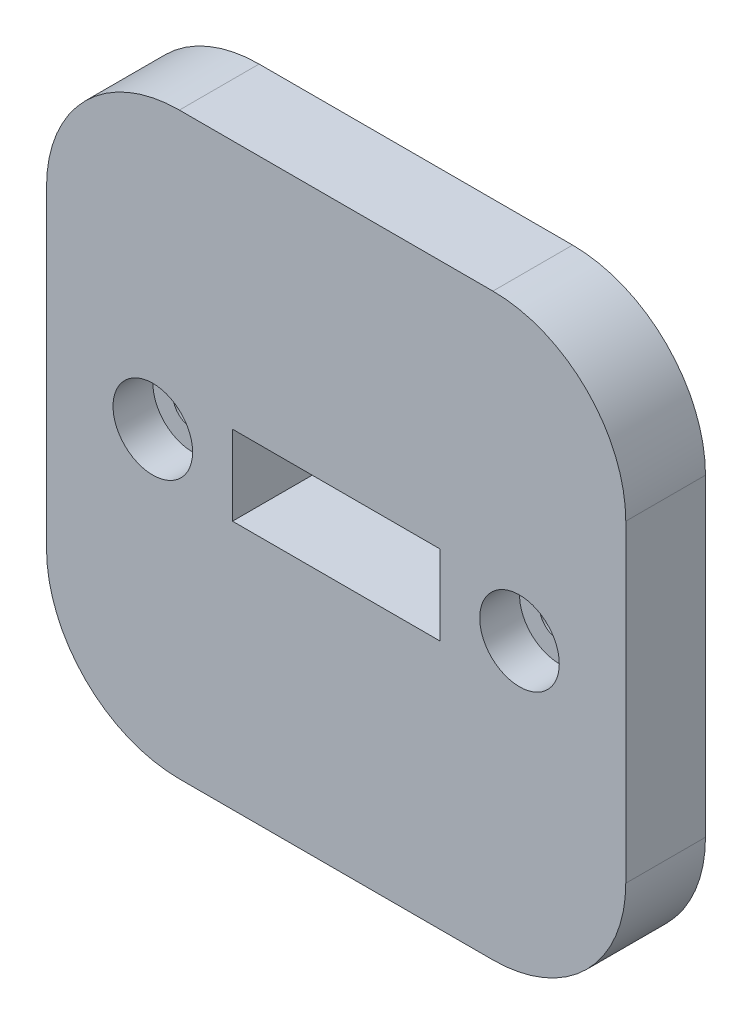
ISO-10303-21;
HEADER;
FILE_DESCRIPTION(('STEP AP214'),'2;1');
FILE_NAME('part.step','',(''),(''),'','','');
FILE_SCHEMA(('AUTOMOTIVE_DESIGN { 1 0 10303 214 1 1 1 1 }'));
ENDSEC;
DATA;
#1=APPLICATION_CONTEXT('core data for automotive mechanical design processes');
#2=APPLICATION_PROTOCOL_DEFINITION('international standard','automotive_design',2000,#1);
#3=PRODUCT_CONTEXT('',#1,'mechanical');
#4=PRODUCT('Part','Part','',(#3));
#5=PRODUCT_RELATED_PRODUCT_CATEGORY('part','',(#4));
#6=PRODUCT_DEFINITION_FORMATION('','',#4);
#7=PRODUCT_DEFINITION_CONTEXT('part definition',#1,'design');
#8=PRODUCT_DEFINITION('design','',#6,#7);
#9=PRODUCT_DEFINITION_SHAPE('','',#8);
#10=(LENGTH_UNIT() NAMED_UNIT(*) SI_UNIT(.MILLI.,.METRE.));
#11=(NAMED_UNIT(*) PLANE_ANGLE_UNIT() SI_UNIT($,.RADIAN.));
#12=(NAMED_UNIT(*) SI_UNIT($,.STERADIAN.) SOLID_ANGLE_UNIT());
#13=UNCERTAINTY_MEASURE_WITH_UNIT(LENGTH_MEASURE(1.E-05),#10,'distance_accuracy_value','');
#14=(GEOMETRIC_REPRESENTATION_CONTEXT(3) GLOBAL_UNCERTAINTY_ASSIGNED_CONTEXT((#13)) GLOBAL_UNIT_ASSIGNED_CONTEXT((#10,
#11,#12)) REPRESENTATION_CONTEXT('',''));
#15=CARTESIAN_POINT('',(0.,0.,0.));
#16=DIRECTION('',(0.,0.,1.));
#17=DIRECTION('',(1.,0.,0.));
#18=AXIS2_PLACEMENT_3D('',#15,#16,#17);
#19=CARTESIAN_POINT('',(35.6,21.8,0.));
#20=DIRECTION('',(0.,0.,1.));
#21=DIRECTION('',(1.,0.,0.));
#22=AXIS2_PLACEMENT_3D('',#19,#20,#21);
#23=CYLINDRICAL_SURFACE('',#22,1.5);
#24=CARTESIAN_POINT('',(35.6,21.8,0.));
#25=DIRECTION('',(0.,0.,1.));
#26=DIRECTION('',(1.,0.,0.));
#27=AXIS2_PLACEMENT_3D('',#24,#25,#26);
#28=CIRCLE('',#27,1.5);
#29=CARTESIAN_POINT('',(37.1,21.8,0.));
#30=VERTEX_POINT('',#29);
#31=EDGE_CURVE('E220',#30,#30,#28,.T.);
#32=ORIENTED_EDGE('',*,*,#31,.F.);
#33=EDGE_LOOP('',(#32));
#34=FACE_BOUND('',#33,.T.);
#35=CARTESIAN_POINT('',(35.6,21.8,3.));
#36=DIRECTION('',(0.,0.,1.));
#37=DIRECTION('',(1.,0.,0.));
#38=AXIS2_PLACEMENT_3D('',#35,#36,#37);
#39=CIRCLE('',#38,1.5);
#40=CARTESIAN_POINT('',(37.1,21.8,3.));
#41=VERTEX_POINT('',#40);
#42=EDGE_CURVE('E37',#41,#41,#39,.F.);
#43=ORIENTED_EDGE('',*,*,#42,.F.);
#44=EDGE_LOOP('',(#43));
#45=FACE_BOUND('',#44,.T.);
#46=ADVANCED_FACE('F33',(#34,#45),#23,.F.);
#47=CARTESIAN_POINT('',(8.00000000000001,21.8,0.));
#48=DIRECTION('',(0.,0.,1.));
#49=DIRECTION('',(1.,0.,0.));
#50=AXIS2_PLACEMENT_3D('',#47,#48,#49);
#51=CYLINDRICAL_SURFACE('',#50,1.5);
#52=CARTESIAN_POINT('',(8.00000000000001,21.8,0.));
#53=DIRECTION('',(0.,0.,1.));
#54=DIRECTION('',(1.,0.,0.));
#55=AXIS2_PLACEMENT_3D('',#52,#53,#54);
#56=CIRCLE('',#55,1.5);
#57=CARTESIAN_POINT('',(9.50000000000001,21.8,0.));
#58=VERTEX_POINT('',#57);
#59=EDGE_CURVE('E148',#58,#58,#56,.T.);
#60=ORIENTED_EDGE('',*,*,#59,.F.);
#61=EDGE_LOOP('',(#60));
#62=FACE_BOUND('',#61,.T.);
#63=CARTESIAN_POINT('',(8.00000000000001,21.8,3.));
#64=DIRECTION('',(0.,0.,1.));
#65=DIRECTION('',(1.,0.,0.));
#66=AXIS2_PLACEMENT_3D('',#63,#64,#65);
#67=CIRCLE('',#66,1.5);
#68=CARTESIAN_POINT('',(9.50000000000001,21.8,3.));
#69=VERTEX_POINT('',#68);
#70=EDGE_CURVE('E218',#69,#69,#67,.F.);
#71=ORIENTED_EDGE('',*,*,#70,.F.);
#72=EDGE_LOOP('',(#71));
#73=FACE_BOUND('',#72,.T.);
#74=ADVANCED_FACE('F246',(#62,#73),#51,.F.);
#75=CARTESIAN_POINT('',(0.,0.,6.));
#76=DIRECTION('',(1.,0.,0.));
#77=DIRECTION('',(0.,1.,0.));
#78=AXIS2_PLACEMENT_3D('',#75,#76,#77);
#79=PLANE('',#78);
#80=DIRECTION('',(0.,-1.,0.));
#81=VECTOR('',#80,1.);
#82=CARTESIAN_POINT('',(0.,0.,0.));
#83=LINE('',#82,#81);
#84=CARTESIAN_POINT('',(0.,33.6,0.));
#85=VERTEX_POINT('',#84);
#86=CARTESIAN_POINT('',(0.,10.,0.));
#87=VERTEX_POINT('',#86);
#88=EDGE_CURVE('E160',#85,#87,#83,.T.);
#89=ORIENTED_EDGE('',*,*,#88,.T.);
#90=DIRECTION('',(0.,0.,-1.));
#91=VECTOR('',#90,1.);
#92=CARTESIAN_POINT('',(0.,10.,6.));
#93=LINE('',#92,#91);
#94=CARTESIAN_POINT('',(0.,10.,6.));
#95=VERTEX_POINT('',#94);
#96=EDGE_CURVE('E216',#87,#95,#93,.F.);
#97=ORIENTED_EDGE('',*,*,#96,.T.);
#98=DIRECTION('',(0.,-1.,0.));
#99=VECTOR('',#98,1.);
#100=CARTESIAN_POINT('',(0.,0.,6.));
#101=LINE('',#100,#99);
#102=CARTESIAN_POINT('',(0.,33.6,6.));
#103=VERTEX_POINT('',#102);
#104=EDGE_CURVE('E164',#103,#95,#101,.T.);
#105=ORIENTED_EDGE('',*,*,#104,.F.);
#106=DIRECTION('',(0.,0.,-1.));
#107=VECTOR('',#106,1.);
#108=CARTESIAN_POINT('',(0.,33.6,6.));
#109=LINE('',#108,#107);
#110=EDGE_CURVE('E213',#103,#85,#109,.T.);
#111=ORIENTED_EDGE('',*,*,#110,.T.);
#112=EDGE_LOOP('',(#89,#97,#105,#111));
#113=FACE_BOUND('',#112,.T.);
#114=ADVANCED_FACE('F252',(#113),#79,.F.);
#115=CARTESIAN_POINT('',(0.,0.,6.));
#116=DIRECTION('',(0.,1.,0.));
#117=DIRECTION('',(0.,0.,1.));
#118=AXIS2_PLACEMENT_3D('',#115,#116,#117);
#119=PLANE('',#118);
#120=DIRECTION('',(1.,0.,0.));
#121=VECTOR('',#120,1.);
#122=CARTESIAN_POINT('',(0.,0.,0.));
#123=LINE('',#122,#121);
#124=CARTESIAN_POINT('',(10.,0.,0.));
#125=VERTEX_POINT('',#124);
#126=CARTESIAN_POINT('',(33.6,0.,0.));
#127=VERTEX_POINT('',#126);
#128=EDGE_CURVE('E180',#125,#127,#123,.T.);
#129=ORIENTED_EDGE('',*,*,#128,.T.);
#130=DIRECTION('',(0.,0.,-1.));
#131=VECTOR('',#130,1.);
#132=CARTESIAN_POINT('',(33.6,0.,6.));
#133=LINE('',#132,#131);
#134=CARTESIAN_POINT('',(33.6,0.,6.));
#135=VERTEX_POINT('',#134);
#136=EDGE_CURVE('E203',#127,#135,#133,.F.);
#137=ORIENTED_EDGE('',*,*,#136,.T.);
#138=DIRECTION('',(1.,0.,0.));
#139=VECTOR('',#138,1.);
#140=CARTESIAN_POINT('',(0.,0.,6.));
#141=LINE('',#140,#139);
#142=CARTESIAN_POINT('',(10.,0.,6.));
#143=VERTEX_POINT('',#142);
#144=EDGE_CURVE('E167',#143,#135,#141,.T.);
#145=ORIENTED_EDGE('',*,*,#144,.F.);
#146=DIRECTION('',(0.,0.,-1.));
#147=VECTOR('',#146,1.);
#148=CARTESIAN_POINT('',(10.,0.,6.));
#149=LINE('',#148,#147);
#150=EDGE_CURVE('E200',#143,#125,#149,.T.);
#151=ORIENTED_EDGE('',*,*,#150,.T.);
#152=EDGE_LOOP('',(#129,#137,#145,#151));
#153=FACE_BOUND('',#152,.T.);
#154=ADVANCED_FACE('F287',(#153),#119,.F.);
#155=CARTESIAN_POINT('',(43.6,0.,6.));
#156=DIRECTION('',(-1.,0.,0.));
#157=DIRECTION('',(0.,0.,1.));
#158=AXIS2_PLACEMENT_3D('',#155,#156,#157);
#159=PLANE('',#158);
#160=DIRECTION('',(0.,1.,0.));
#161=VECTOR('',#160,1.);
#162=CARTESIAN_POINT('',(43.6,0.,6.));
#163=LINE('',#162,#161);
#164=CARTESIAN_POINT('',(43.6,10.,6.));
#165=VERTEX_POINT('',#164);
#166=CARTESIAN_POINT('',(43.6,33.6,6.));
#167=VERTEX_POINT('',#166);
#168=EDGE_CURVE('E171',#165,#167,#163,.T.);
#169=ORIENTED_EDGE('',*,*,#168,.F.);
#170=DIRECTION('',(0.,0.,-1.));
#171=VECTOR('',#170,1.);
#172=CARTESIAN_POINT('',(43.6,10.,6.));
#173=LINE('',#172,#171);
#174=CARTESIAN_POINT('',(43.6,10.,0.));
#175=VERTEX_POINT('',#174);
#176=EDGE_CURVE('E189',#165,#175,#173,.T.);
#177=ORIENTED_EDGE('',*,*,#176,.T.);
#178=DIRECTION('',(0.,1.,0.));
#179=VECTOR('',#178,1.);
#180=CARTESIAN_POINT('',(43.6,0.,0.));
#181=LINE('',#180,#179);
#182=CARTESIAN_POINT('',(43.6,33.6,0.));
#183=VERTEX_POINT('',#182);
#184=EDGE_CURVE('E183',#175,#183,#181,.T.);
#185=ORIENTED_EDGE('',*,*,#184,.T.);
#186=DIRECTION('',(0.,0.,-1.));
#187=VECTOR('',#186,1.);
#188=CARTESIAN_POINT('',(43.6,33.6,6.));
#189=LINE('',#188,#187);
#190=EDGE_CURVE('E177',#183,#167,#189,.F.);
#191=ORIENTED_EDGE('',*,*,#190,.T.);
#192=EDGE_LOOP('',(#169,#177,#185,#191));
#193=FACE_BOUND('',#192,.T.);
#194=ADVANCED_FACE('F283',(#193),#159,.F.);
#195=CARTESIAN_POINT('',(0.,43.6,6.));
#196=DIRECTION('',(0.,-1.,0.));
#197=DIRECTION('',(0.,0.,-1.));
#198=AXIS2_PLACEMENT_3D('',#195,#196,#197);
#199=PLANE('',#198);
#200=DIRECTION('',(-1.,0.,0.));
#201=VECTOR('',#200,1.);
#202=CARTESIAN_POINT('',(0.,43.6,6.));
#203=LINE('',#202,#201);
#204=CARTESIAN_POINT('',(33.6,43.6,6.));
#205=VERTEX_POINT('',#204);
#206=CARTESIAN_POINT('',(10.,43.6,6.));
#207=VERTEX_POINT('',#206);
#208=EDGE_CURVE('E174',#205,#207,#203,.T.);
#209=ORIENTED_EDGE('',*,*,#208,.F.);
#210=DIRECTION('',(0.,0.,-1.));
#211=VECTOR('',#210,1.);
#212=CARTESIAN_POINT('',(33.6,43.6,6.));
#213=LINE('',#212,#211);
#214=CARTESIAN_POINT('',(33.6,43.6,0.));
#215=VERTEX_POINT('',#214);
#216=EDGE_CURVE('E11',#205,#215,#213,.T.);
#217=ORIENTED_EDGE('',*,*,#216,.T.);
#218=DIRECTION('',(-1.,0.,0.));
#219=VECTOR('',#218,1.);
#220=CARTESIAN_POINT('',(0.,43.6,0.));
#221=LINE('',#220,#219);
#222=CARTESIAN_POINT('',(10.,43.6,0.));
#223=VERTEX_POINT('',#222);
#224=EDGE_CURVE('E168',#215,#223,#221,.T.);
#225=ORIENTED_EDGE('',*,*,#224,.T.);
#226=DIRECTION('',(0.,0.,-1.));
#227=VECTOR('',#226,1.);
#228=CARTESIAN_POINT('',(10.,43.6,6.));
#229=LINE('',#228,#227);
#230=EDGE_CURVE('E42',#223,#207,#229,.F.);
#231=ORIENTED_EDGE('',*,*,#230,.T.);
#232=EDGE_LOOP('',(#209,#217,#225,#231));
#233=FACE_BOUND('',#232,.T.);
#234=ADVANCED_FACE('F275',(#233),#199,.F.);
#235=CARTESIAN_POINT('',(0.,0.,6.));
#236=DIRECTION('',(0.,0.,-1.));
#237=DIRECTION('',(-1.,0.,0.));
#238=AXIS2_PLACEMENT_3D('',#235,#236,#237);
#239=PLANE('',#238);
#240=CARTESIAN_POINT('',(35.6,21.8,6.));
#241=DIRECTION('',(0.,0.,1.));
#242=DIRECTION('',(1.,0.,0.));
#243=AXIS2_PLACEMENT_3D('',#240,#241,#242);
#244=CIRCLE('',#243,2.995);
#245=CARTESIAN_POINT('',(38.595,21.8,6.));
#246=VERTEX_POINT('',#245);
#247=EDGE_CURVE('E233',#246,#246,#244,.T.);
#248=ORIENTED_EDGE('',*,*,#247,.F.);
#249=EDGE_LOOP('',(#248));
#250=FACE_BOUND('',#249,.T.);
#251=CARTESIAN_POINT('',(8.00000000000001,21.8,6.));
#252=DIRECTION('',(0.,0.,1.));
#253=DIRECTION('',(1.,0.,0.));
#254=AXIS2_PLACEMENT_3D('',#251,#252,#253);
#255=CIRCLE('',#254,2.995);
#256=CARTESIAN_POINT('',(10.995,21.8,6.));
#257=VERTEX_POINT('',#256);
#258=EDGE_CURVE('E226',#257,#257,#255,.T.);
#259=ORIENTED_EDGE('',*,*,#258,.F.);
#260=EDGE_LOOP('',(#259));
#261=FACE_BOUND('',#260,.T.);
#262=DIRECTION('',(1.,0.,0.));
#263=VECTOR('',#262,1.);
#264=CARTESIAN_POINT('',(14.,18.8,6.));
#265=LINE('',#264,#263);
#266=CARTESIAN_POINT('',(14.,18.8,6.));
#267=VERTEX_POINT('',#266);
#268=CARTESIAN_POINT('',(29.6,18.8,6.));
#269=VERTEX_POINT('',#268);
#270=EDGE_CURVE('E154',#267,#269,#265,.T.);
#271=ORIENTED_EDGE('',*,*,#270,.F.);
#272=DIRECTION('',(0.,-1.,0.));
#273=VECTOR('',#272,1.);
#274=CARTESIAN_POINT('',(14.,18.8,6.));
#275=LINE('',#274,#273);
#276=CARTESIAN_POINT('',(14.,24.8,6.));
#277=VERTEX_POINT('',#276);
#278=EDGE_CURVE('E50',#277,#267,#275,.T.);
#279=ORIENTED_EDGE('',*,*,#278,.F.);
#280=DIRECTION('',(-1.,0.,0.));
#281=VECTOR('',#280,1.);
#282=CARTESIAN_POINT('',(14.,24.8,6.));
#283=LINE('',#282,#281);
#284=CARTESIAN_POINT('',(29.6,24.8,6.));
#285=VERTEX_POINT('',#284);
#286=EDGE_CURVE('E142',#285,#277,#283,.T.);
#287=ORIENTED_EDGE('',*,*,#286,.F.);
#288=DIRECTION('',(0.,1.,0.));
#289=VECTOR('',#288,1.);
#290=CARTESIAN_POINT('',(29.6,18.8,6.));
#291=LINE('',#290,#289);
#292=EDGE_CURVE('E145',#269,#285,#291,.T.);
#293=ORIENTED_EDGE('',*,*,#292,.F.);
#294=EDGE_LOOP('',(#271,#279,#287,#293));
#295=FACE_BOUND('',#294,.T.);
#296=ORIENTED_EDGE('',*,*,#144,.T.);
#297=CARTESIAN_POINT('',(33.6,10.,6.));
#298=DIRECTION('',(0.,0.,-1.));
#299=DIRECTION('',(-1.,0.,0.));
#300=AXIS2_PLACEMENT_3D('',#297,#298,#299);
#301=CIRCLE('',#300,10.);
#302=EDGE_CURVE('E211',#135,#165,#301,.F.);
#303=ORIENTED_EDGE('',*,*,#302,.T.);
#304=ORIENTED_EDGE('',*,*,#168,.T.);
#305=CARTESIAN_POINT('',(33.6,33.6,6.));
#306=DIRECTION('',(0.,0.,-1.));
#307=DIRECTION('',(-1.,0.,0.));
#308=AXIS2_PLACEMENT_3D('',#305,#306,#307);
#309=CIRCLE('',#308,10.);
#310=EDGE_CURVE('E207',#167,#205,#309,.F.);
#311=ORIENTED_EDGE('',*,*,#310,.T.);
#312=ORIENTED_EDGE('',*,*,#208,.T.);
#313=CARTESIAN_POINT('',(10.,33.6,6.));
#314=DIRECTION('',(0.,0.,-1.));
#315=DIRECTION('',(-1.,0.,0.));
#316=AXIS2_PLACEMENT_3D('',#313,#314,#315);
#317=CIRCLE('',#316,10.);
#318=EDGE_CURVE('E205',#207,#103,#317,.F.);
#319=ORIENTED_EDGE('',*,*,#318,.T.);
#320=ORIENTED_EDGE('',*,*,#104,.T.);
#321=CARTESIAN_POINT('',(10.,10.,6.));
#322=DIRECTION('',(0.,0.,-1.));
#323=DIRECTION('',(-1.,0.,0.));
#324=AXIS2_PLACEMENT_3D('',#321,#322,#323);
#325=CIRCLE('',#324,10.);
#326=EDGE_CURVE('E209',#95,#143,#325,.F.);
#327=ORIENTED_EDGE('',*,*,#326,.T.);
#328=EDGE_LOOP('',(#296,#303,#304,#311,#312,#319,#320,#327));
#329=FACE_BOUND('',#328,.T.);
#330=ADVANCED_FACE('F272',(#250,#261,#295,#329),#239,.F.);
#331=CARTESIAN_POINT('',(0.,0.,0.));
#332=DIRECTION('',(0.,0.,-1.));
#333=DIRECTION('',(-1.,0.,0.));
#334=AXIS2_PLACEMENT_3D('',#331,#332,#333);
#335=PLANE('',#334);
#336=ORIENTED_EDGE('',*,*,#31,.T.);
#337=EDGE_LOOP('',(#336));
#338=FACE_BOUND('',#337,.T.);
#339=ORIENTED_EDGE('',*,*,#59,.T.);
#340=EDGE_LOOP('',(#339));
#341=FACE_BOUND('',#340,.T.);
#342=DIRECTION('',(0.,-1.,0.));
#343=VECTOR('',#342,1.);
#344=CARTESIAN_POINT('',(14.,18.8,0.));
#345=LINE('',#344,#343);
#346=CARTESIAN_POINT('',(14.,24.8,0.));
#347=VERTEX_POINT('',#346);
#348=CARTESIAN_POINT('',(14.,18.8,0.));
#349=VERTEX_POINT('',#348);
#350=EDGE_CURVE('E126',#347,#349,#345,.T.);
#351=ORIENTED_EDGE('',*,*,#350,.T.);
#352=DIRECTION('',(1.,0.,0.));
#353=VECTOR('',#352,1.);
#354=CARTESIAN_POINT('',(14.,18.8,0.));
#355=LINE('',#354,#353);
#356=CARTESIAN_POINT('',(29.6,18.8,0.));
#357=VERTEX_POINT('',#356);
#358=EDGE_CURVE('E135',#349,#357,#355,.T.);
#359=ORIENTED_EDGE('',*,*,#358,.T.);
#360=DIRECTION('',(0.,1.,0.));
#361=VECTOR('',#360,1.);
#362=CARTESIAN_POINT('',(29.6,18.8,0.));
#363=LINE('',#362,#361);
#364=CARTESIAN_POINT('',(29.6,24.8,0.));
#365=VERTEX_POINT('',#364);
#366=EDGE_CURVE('E58',#357,#365,#363,.T.);
#367=ORIENTED_EDGE('',*,*,#366,.T.);
#368=DIRECTION('',(-1.,0.,0.));
#369=VECTOR('',#368,1.);
#370=CARTESIAN_POINT('',(14.,24.8,0.));
#371=LINE('',#370,#369);
#372=EDGE_CURVE('E132',#365,#347,#371,.T.);
#373=ORIENTED_EDGE('',*,*,#372,.T.);
#374=EDGE_LOOP('',(#351,#359,#367,#373));
#375=FACE_BOUND('',#374,.T.);
#376=ORIENTED_EDGE('',*,*,#184,.F.);
#377=CARTESIAN_POINT('',(33.6,10.,0.));
#378=DIRECTION('',(0.,0.,-1.));
#379=DIRECTION('',(-1.,0.,0.));
#380=AXIS2_PLACEMENT_3D('',#377,#378,#379);
#381=CIRCLE('',#380,10.);
#382=EDGE_CURVE('E198',#175,#127,#381,.T.);
#383=ORIENTED_EDGE('',*,*,#382,.T.);
#384=ORIENTED_EDGE('',*,*,#128,.F.);
#385=CARTESIAN_POINT('',(10.,10.,0.));
#386=DIRECTION('',(0.,0.,-1.));
#387=DIRECTION('',(-1.,0.,0.));
#388=AXIS2_PLACEMENT_3D('',#385,#386,#387);
#389=CIRCLE('',#388,10.);
#390=EDGE_CURVE('E196',#125,#87,#389,.T.);
#391=ORIENTED_EDGE('',*,*,#390,.T.);
#392=ORIENTED_EDGE('',*,*,#88,.F.);
#393=CARTESIAN_POINT('',(10.,33.6,0.));
#394=DIRECTION('',(0.,0.,-1.));
#395=DIRECTION('',(-1.,0.,0.));
#396=AXIS2_PLACEMENT_3D('',#393,#394,#395);
#397=CIRCLE('',#396,10.);
#398=EDGE_CURVE('E192',#85,#223,#397,.T.);
#399=ORIENTED_EDGE('',*,*,#398,.T.);
#400=ORIENTED_EDGE('',*,*,#224,.F.);
#401=CARTESIAN_POINT('',(33.6,33.6,0.));
#402=DIRECTION('',(0.,0.,-1.));
#403=DIRECTION('',(-1.,0.,0.));
#404=AXIS2_PLACEMENT_3D('',#401,#402,#403);
#405=CIRCLE('',#404,10.);
#406=EDGE_CURVE('E194',#215,#183,#405,.T.);
#407=ORIENTED_EDGE('',*,*,#406,.T.);
#408=EDGE_LOOP('',(#376,#383,#384,#391,#392,#399,#400,#407));
#409=FACE_BOUND('',#408,.T.);
#410=ADVANCED_FACE('F139',(#338,#341,#375,#409),#335,.T.);
#411=CARTESIAN_POINT('',(33.6,10.,6.));
#412=DIRECTION('',(0.,0.,-1.));
#413=DIRECTION('',(-1.,0.,0.));
#414=AXIS2_PLACEMENT_3D('',#411,#412,#413);
#415=CYLINDRICAL_SURFACE('',#414,10.);
#416=ORIENTED_EDGE('',*,*,#302,.F.);
#417=ORIENTED_EDGE('',*,*,#136,.F.);
#418=ORIENTED_EDGE('',*,*,#382,.F.);
#419=ORIENTED_EDGE('',*,*,#176,.F.);
#420=EDGE_LOOP('',(#416,#417,#418,#419));
#421=FACE_BOUND('',#420,.T.);
#422=ADVANCED_FACE('F279',(#421),#415,.T.);
#423=CARTESIAN_POINT('',(10.,10.,6.));
#424=DIRECTION('',(0.,0.,-1.));
#425=DIRECTION('',(-1.,0.,0.));
#426=AXIS2_PLACEMENT_3D('',#423,#424,#425);
#427=CYLINDRICAL_SURFACE('',#426,10.);
#428=ORIENTED_EDGE('',*,*,#326,.F.);
#429=ORIENTED_EDGE('',*,*,#96,.F.);
#430=ORIENTED_EDGE('',*,*,#390,.F.);
#431=ORIENTED_EDGE('',*,*,#150,.F.);
#432=EDGE_LOOP('',(#428,#429,#430,#431));
#433=FACE_BOUND('',#432,.T.);
#434=ADVANCED_FACE('F297',(#433),#427,.T.);
#435=CARTESIAN_POINT('',(33.6,33.6,6.));
#436=DIRECTION('',(0.,0.,-1.));
#437=DIRECTION('',(-1.,0.,0.));
#438=AXIS2_PLACEMENT_3D('',#435,#436,#437);
#439=CYLINDRICAL_SURFACE('',#438,10.);
#440=ORIENTED_EDGE('',*,*,#310,.F.);
#441=ORIENTED_EDGE('',*,*,#190,.F.);
#442=ORIENTED_EDGE('',*,*,#406,.F.);
#443=ORIENTED_EDGE('',*,*,#216,.F.);
#444=EDGE_LOOP('',(#440,#441,#442,#443));
#445=FACE_BOUND('',#444,.T.);
#446=ADVANCED_FACE('F300',(#445),#439,.T.);
#447=CARTESIAN_POINT('',(10.,33.6,6.));
#448=DIRECTION('',(0.,0.,-1.));
#449=DIRECTION('',(-1.,0.,0.));
#450=AXIS2_PLACEMENT_3D('',#447,#448,#449);
#451=CYLINDRICAL_SURFACE('',#450,10.);
#452=ORIENTED_EDGE('',*,*,#318,.F.);
#453=ORIENTED_EDGE('',*,*,#230,.F.);
#454=ORIENTED_EDGE('',*,*,#398,.F.);
#455=ORIENTED_EDGE('',*,*,#110,.F.);
#456=EDGE_LOOP('',(#452,#453,#454,#455));
#457=FACE_BOUND('',#456,.T.);
#458=ADVANCED_FACE('F35',(#457),#451,.T.);
#459=CARTESIAN_POINT('',(14.,18.8,0.));
#460=DIRECTION('',(-1.,0.,0.));
#461=DIRECTION('',(0.,0.,1.));
#462=AXIS2_PLACEMENT_3D('',#459,#460,#461);
#463=PLANE('',#462);
#464=ORIENTED_EDGE('',*,*,#278,.T.);
#465=DIRECTION('',(0.,0.,1.));
#466=VECTOR('',#465,1.);
#467=CARTESIAN_POINT('',(14.,18.8,0.));
#468=LINE('',#467,#466);
#469=EDGE_CURVE('E122',#349,#267,#468,.T.);
#470=ORIENTED_EDGE('',*,*,#469,.F.);
#471=ORIENTED_EDGE('',*,*,#350,.F.);
#472=DIRECTION('',(0.,0.,1.));
#473=VECTOR('',#472,1.);
#474=CARTESIAN_POINT('',(14.,24.8,0.));
#475=LINE('',#474,#473);
#476=EDGE_CURVE('E158',#347,#277,#475,.T.);
#477=ORIENTED_EDGE('',*,*,#476,.T.);
#478=EDGE_LOOP('',(#464,#470,#471,#477));
#479=FACE_BOUND('',#478,.T.);
#480=ADVANCED_FACE('F124',(#479),#463,.F.);
#481=CARTESIAN_POINT('',(14.,24.8,0.));
#482=DIRECTION('',(0.,1.,0.));
#483=DIRECTION('',(0.,0.,1.));
#484=AXIS2_PLACEMENT_3D('',#481,#482,#483);
#485=PLANE('',#484);
#486=ORIENTED_EDGE('',*,*,#286,.T.);
#487=ORIENTED_EDGE('',*,*,#476,.F.);
#488=ORIENTED_EDGE('',*,*,#372,.F.);
#489=DIRECTION('',(0.,0.,1.));
#490=VECTOR('',#489,1.);
#491=CARTESIAN_POINT('',(29.6,24.8,0.));
#492=LINE('',#491,#490);
#493=EDGE_CURVE('E161',#365,#285,#492,.T.);
#494=ORIENTED_EDGE('',*,*,#493,.T.);
#495=EDGE_LOOP('',(#486,#487,#488,#494));
#496=FACE_BOUND('',#495,.T.);
#497=ADVANCED_FACE('F260',(#496),#485,.F.);
#498=CARTESIAN_POINT('',(29.6,18.8,0.));
#499=DIRECTION('',(1.,0.,0.));
#500=DIRECTION('',(0.,0.,-1.));
#501=AXIS2_PLACEMENT_3D('',#498,#499,#500);
#502=PLANE('',#501);
#503=ORIENTED_EDGE('',*,*,#292,.T.);
#504=ORIENTED_EDGE('',*,*,#493,.F.);
#505=ORIENTED_EDGE('',*,*,#366,.F.);
#506=DIRECTION('',(0.,0.,1.));
#507=VECTOR('',#506,1.);
#508=CARTESIAN_POINT('',(29.6,18.8,0.));
#509=LINE('',#508,#507);
#510=EDGE_CURVE('E131',#357,#269,#509,.T.);
#511=ORIENTED_EDGE('',*,*,#510,.T.);
#512=EDGE_LOOP('',(#503,#504,#505,#511));
#513=FACE_BOUND('',#512,.T.);
#514=ADVANCED_FACE('F263',(#513),#502,.F.);
#515=CARTESIAN_POINT('',(14.,18.8,0.));
#516=DIRECTION('',(0.,-1.,0.));
#517=DIRECTION('',(0.,0.,-1.));
#518=AXIS2_PLACEMENT_3D('',#515,#516,#517);
#519=PLANE('',#518);
#520=ORIENTED_EDGE('',*,*,#270,.T.);
#521=ORIENTED_EDGE('',*,*,#510,.F.);
#522=ORIENTED_EDGE('',*,*,#358,.F.);
#523=ORIENTED_EDGE('',*,*,#469,.T.);
#524=EDGE_LOOP('',(#520,#521,#522,#523));
#525=FACE_BOUND('',#524,.T.);
#526=ADVANCED_FACE('F136',(#525),#519,.F.);
#527=CARTESIAN_POINT('',(8.00000000000001,21.8,3.));
#528=DIRECTION('',(0.,0.,1.));
#529=DIRECTION('',(1.,0.,0.));
#530=AXIS2_PLACEMENT_3D('',#527,#528,#529);
#531=PLANE('',#530);
#532=CARTESIAN_POINT('',(8.00000000000001,21.8,3.));
#533=DIRECTION('',(0.,0.,1.));
#534=DIRECTION('',(1.,0.,0.));
#535=AXIS2_PLACEMENT_3D('',#532,#533,#534);
#536=CIRCLE('',#535,2.995);
#537=CARTESIAN_POINT('',(10.995,21.8,3.));
#538=VERTEX_POINT('',#537);
#539=EDGE_CURVE('E221',#538,#538,#536,.T.);
#540=ORIENTED_EDGE('',*,*,#539,.T.);
#541=EDGE_LOOP('',(#540));
#542=FACE_BOUND('',#541,.T.);
#543=ORIENTED_EDGE('',*,*,#70,.T.);
#544=EDGE_LOOP('',(#543));
#545=FACE_BOUND('',#544,.T.);
#546=ADVANCED_FACE('F269',(#542,#545),#531,.T.);
#547=CARTESIAN_POINT('',(8.00000000000001,21.8,3.));
#548=DIRECTION('',(0.,0.,1.));
#549=DIRECTION('',(1.,0.,0.));
#550=AXIS2_PLACEMENT_3D('',#547,#548,#549);
#551=CYLINDRICAL_SURFACE('',#550,2.995);
#552=ORIENTED_EDGE('',*,*,#539,.F.);
#553=EDGE_LOOP('',(#552));
#554=FACE_BOUND('',#553,.T.);
#555=ORIENTED_EDGE('',*,*,#258,.T.);
#556=EDGE_LOOP('',(#555));
#557=FACE_BOUND('',#556,.T.);
#558=ADVANCED_FACE('F257',(#554,#557),#551,.F.);
#559=CARTESIAN_POINT('',(35.6,21.8,3.));
#560=DIRECTION('',(0.,0.,1.));
#561=DIRECTION('',(1.,0.,0.));
#562=AXIS2_PLACEMENT_3D('',#559,#560,#561);
#563=PLANE('',#562);
#564=CARTESIAN_POINT('',(35.6,21.8,3.));
#565=DIRECTION('',(0.,0.,1.));
#566=DIRECTION('',(1.,0.,0.));
#567=AXIS2_PLACEMENT_3D('',#564,#565,#566);
#568=CIRCLE('',#567,2.995);
#569=CARTESIAN_POINT('',(38.595,21.8,3.));
#570=VERTEX_POINT('',#569);
#571=EDGE_CURVE('E236',#570,#570,#568,.T.);
#572=ORIENTED_EDGE('',*,*,#571,.T.);
#573=EDGE_LOOP('',(#572));
#574=FACE_BOUND('',#573,.T.);
#575=ORIENTED_EDGE('',*,*,#42,.T.);
#576=EDGE_LOOP('',(#575));
#577=FACE_BOUND('',#576,.T.);
#578=ADVANCED_FACE('F243',(#574,#577),#563,.T.);
#579=CARTESIAN_POINT('',(35.6,21.8,3.));
#580=DIRECTION('',(0.,0.,1.));
#581=DIRECTION('',(1.,0.,0.));
#582=AXIS2_PLACEMENT_3D('',#579,#580,#581);
#583=CYLINDRICAL_SURFACE('',#582,2.995);
#584=ORIENTED_EDGE('',*,*,#571,.F.);
#585=EDGE_LOOP('',(#584));
#586=FACE_BOUND('',#585,.T.);
#587=ORIENTED_EDGE('',*,*,#247,.T.);
#588=EDGE_LOOP('',(#587));
#589=FACE_BOUND('',#588,.T.);
#590=ADVANCED_FACE('F366',(#586,#589),#583,.F.);
#591=CLOSED_SHELL('',(#46,#74,#114,#154,#194,#234,#330,#410,#422,#434,#446,#458,#480,#497,#514,
#526,#546,#558,#578,#590));
#592=MANIFOLD_SOLID_BREP('B2',#591);
#593=ADVANCED_BREP_SHAPE_REPRESENTATION('',(#18,#592),#14);
#594=SHAPE_DEFINITION_REPRESENTATION(#9,#593);
ENDSEC;
END-ISO-10303-21;
